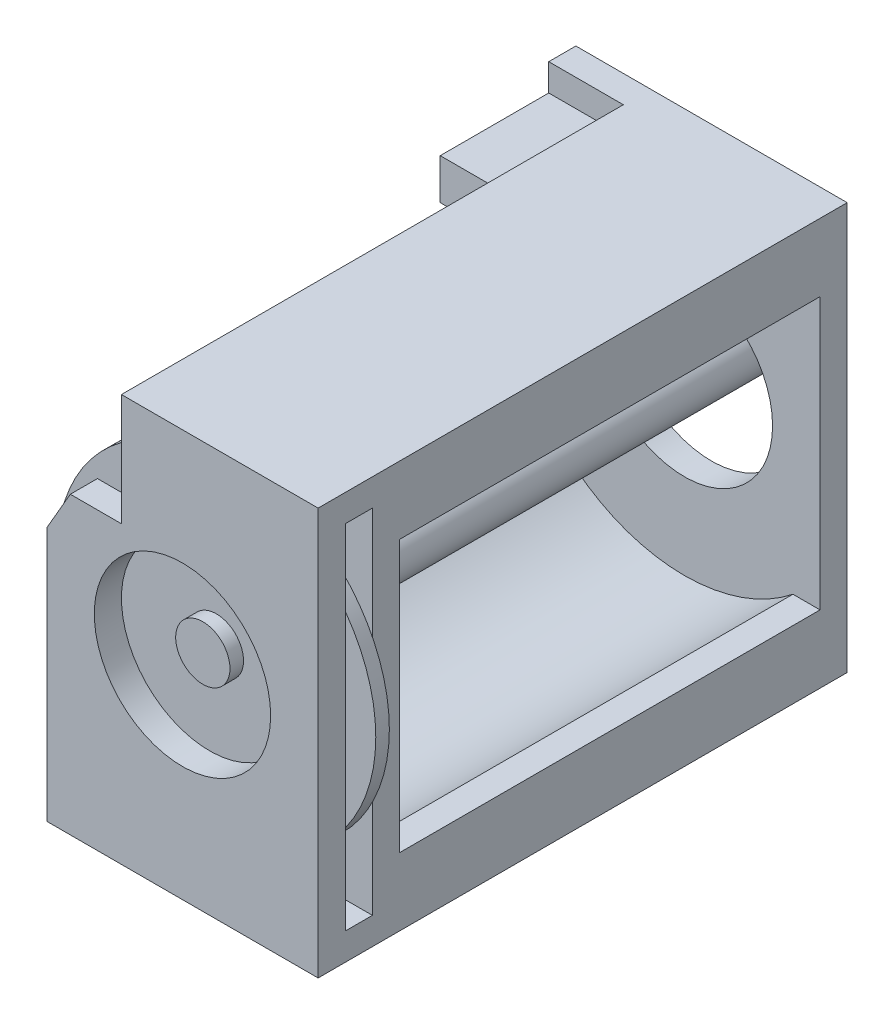
ISO-10303-21;
HEADER;
FILE_DESCRIPTION(('STEP AP214'),'2;1');
FILE_NAME('part.step','',(''),(''),'','','');
FILE_SCHEMA(('AUTOMOTIVE_DESIGN { 1 0 10303 214 1 1 1 1 }'));
ENDSEC;
DATA;
#1=APPLICATION_CONTEXT('core data for automotive mechanical design processes');
#2=APPLICATION_PROTOCOL_DEFINITION('international standard','automotive_design',2000,#1);
#3=PRODUCT_CONTEXT('',#1,'mechanical');
#4=PRODUCT('Part','Part','',(#3));
#5=PRODUCT_RELATED_PRODUCT_CATEGORY('part','',(#4));
#6=PRODUCT_DEFINITION_FORMATION('','',#4);
#7=PRODUCT_DEFINITION_CONTEXT('part definition',#1,'design');
#8=PRODUCT_DEFINITION('design','',#6,#7);
#9=PRODUCT_DEFINITION_SHAPE('','',#8);
#10=(LENGTH_UNIT() NAMED_UNIT(*) SI_UNIT(.MILLI.,.METRE.));
#11=(NAMED_UNIT(*) PLANE_ANGLE_UNIT() SI_UNIT($,.RADIAN.));
#12=(NAMED_UNIT(*) SI_UNIT($,.STERADIAN.) SOLID_ANGLE_UNIT());
#13=UNCERTAINTY_MEASURE_WITH_UNIT(LENGTH_MEASURE(1.E-05),#10,'distance_accuracy_value','');
#14=(GEOMETRIC_REPRESENTATION_CONTEXT(3) GLOBAL_UNCERTAINTY_ASSIGNED_CONTEXT((#13)) GLOBAL_UNIT_ASSIGNED_CONTEXT((#10,
#11,#12)) REPRESENTATION_CONTEXT('',''));
#15=CARTESIAN_POINT('',(0.,0.,0.));
#16=DIRECTION('',(0.,0.,1.));
#17=DIRECTION('',(1.,0.,0.));
#18=AXIS2_PLACEMENT_3D('',#15,#16,#17);
#19=CARTESIAN_POINT('',(0.,0.,-5.));
#20=DIRECTION('',(0.,0.,1.));
#21=DIRECTION('',(1.,0.,0.));
#22=AXIS2_PLACEMENT_3D('',#19,#20,#21);
#23=CYLINDRICAL_SURFACE('',#22,2.);
#24=CARTESIAN_POINT('',(0.,0.,-5.));
#25=DIRECTION('',(0.,0.,1.));
#26=DIRECTION('',(1.,0.,0.));
#27=AXIS2_PLACEMENT_3D('',#24,#25,#26);
#28=CIRCLE('',#27,2.);
#29=CARTESIAN_POINT('',(2.,0.,-5.));
#30=VERTEX_POINT('',#29);
#31=EDGE_CURVE('E11',#30,#30,#28,.T.);
#32=ORIENTED_EDGE('',*,*,#31,.T.);
#33=EDGE_LOOP('',(#32));
#34=FACE_BOUND('',#33,.T.);
#35=CARTESIAN_POINT('',(0.,0.,37.5));
#36=DIRECTION('',(0.,0.,1.));
#37=DIRECTION('',(1.,0.,0.));
#38=AXIS2_PLACEMENT_3D('',#35,#36,#37);
#39=CIRCLE('',#38,2.);
#40=CARTESIAN_POINT('',(2.,0.,37.5));
#41=VERTEX_POINT('',#40);
#42=EDGE_CURVE('E49',#41,#41,#39,.T.);
#43=ORIENTED_EDGE('',*,*,#42,.F.);
#44=EDGE_LOOP('',(#43));
#45=FACE_BOUND('',#44,.T.);
#46=ADVANCED_FACE('F43',(#34,#45),#23,.T.);
#47=CARTESIAN_POINT('',(0.,0.,-5.));
#48=DIRECTION('',(0.,0.,1.));
#49=DIRECTION('',(1.,0.,0.));
#50=AXIS2_PLACEMENT_3D('',#47,#48,#49);
#51=PLANE('',#50);
#52=ORIENTED_EDGE('',*,*,#31,.F.);
#53=EDGE_LOOP('',(#52));
#54=FACE_BOUND('',#53,.T.);
#55=ADVANCED_FACE('F58',(#54),#51,.F.);
#56=CARTESIAN_POINT('',(0.,0.,37.5));
#57=DIRECTION('',(0.,0.,1.));
#58=DIRECTION('',(1.,0.,0.));
#59=AXIS2_PLACEMENT_3D('',#56,#57,#58);
#60=PLANE('',#59);
#61=ORIENTED_EDGE('',*,*,#42,.T.);
#62=EDGE_LOOP('',(#61));
#63=FACE_BOUND('',#62,.T.);
#64=ADVANCED_FACE('F55',(#63),#60,.T.);
#65=CLOSED_SHELL('',(#46,#55,#64));
#66=MANIFOLD_SOLID_BREP('B2',#65);
#67=CARTESIAN_POINT('',(0.,0.,36.5));
#68=DIRECTION('',(0.,0.,1.));
#69=DIRECTION('',(1.,0.,0.));
#70=AXIS2_PLACEMENT_3D('',#67,#68,#69);
#71=PLANE('',#70);
#72=CARTESIAN_POINT('',(0.,0.,36.5));
#73=DIRECTION('',(0.,0.,1.));
#74=DIRECTION('',(1.,0.,0.));
#75=AXIS2_PLACEMENT_3D('',#72,#73,#74);
#76=CIRCLE('',#75,11.75);
#77=CARTESIAN_POINT('',(11.75,0.,36.5));
#78=VERTEX_POINT('',#77);
#79=EDGE_CURVE('E42',#78,#78,#76,.T.);
#80=ORIENTED_EDGE('',*,*,#79,.T.);
#81=EDGE_LOOP('',(#80));
#82=FACE_BOUND('',#81,.T.);
#83=CARTESIAN_POINT('',(0.,0.,36.5));
#84=DIRECTION('',(0.,0.,1.));
#85=DIRECTION('',(1.,0.,0.));
#86=AXIS2_PLACEMENT_3D('',#83,#84,#85);
#87=CIRCLE('',#86,2.);
#88=CARTESIAN_POINT('',(2.,0.,36.5));
#89=VERTEX_POINT('',#88);
#90=EDGE_CURVE('E103',#89,#89,#87,.T.);
#91=ORIENTED_EDGE('',*,*,#90,.F.);
#92=EDGE_LOOP('',(#91));
#93=FACE_BOUND('',#92,.T.);
#94=ADVANCED_FACE('F92',(#82,#93),#71,.T.);
#95=CARTESIAN_POINT('',(0.,0.,35.5));
#96=DIRECTION('',(0.,0.,1.));
#97=DIRECTION('',(1.,0.,0.));
#98=AXIS2_PLACEMENT_3D('',#95,#96,#97);
#99=PLANE('',#98);
#100=CARTESIAN_POINT('',(0.,0.,35.5));
#101=DIRECTION('',(0.,0.,1.));
#102=DIRECTION('',(1.,0.,0.));
#103=AXIS2_PLACEMENT_3D('',#100,#101,#102);
#104=CIRCLE('',#103,11.75);
#105=CARTESIAN_POINT('',(11.75,0.,35.5));
#106=VERTEX_POINT('',#105);
#107=EDGE_CURVE('E96',#106,#106,#104,.T.);
#108=ORIENTED_EDGE('',*,*,#107,.F.);
#109=EDGE_LOOP('',(#108));
#110=FACE_BOUND('',#109,.T.);
#111=CARTESIAN_POINT('',(0.,0.,35.5));
#112=DIRECTION('',(0.,0.,1.));
#113=DIRECTION('',(1.,0.,0.));
#114=AXIS2_PLACEMENT_3D('',#111,#112,#113);
#115=CIRCLE('',#114,2.);
#116=CARTESIAN_POINT('',(2.,0.,35.5));
#117=VERTEX_POINT('',#116);
#118=EDGE_CURVE('E105',#117,#117,#115,.T.);
#119=ORIENTED_EDGE('',*,*,#118,.T.);
#120=EDGE_LOOP('',(#119));
#121=FACE_BOUND('',#120,.T.);
#122=ADVANCED_FACE('F115',(#110,#121),#99,.F.);
#123=CARTESIAN_POINT('',(0.,0.,36.5));
#124=DIRECTION('',(0.,0.,-1.));
#125=DIRECTION('',(-1.,0.,0.));
#126=AXIS2_PLACEMENT_3D('',#123,#124,#125);
#127=CYLINDRICAL_SURFACE('',#126,11.75);
#128=ORIENTED_EDGE('',*,*,#79,.F.);
#129=EDGE_LOOP('',(#128));
#130=FACE_BOUND('',#129,.T.);
#131=ORIENTED_EDGE('',*,*,#107,.T.);
#132=EDGE_LOOP('',(#131));
#133=FACE_BOUND('',#132,.T.);
#134=ADVANCED_FACE('F94',(#130,#133),#127,.T.);
#135=CARTESIAN_POINT('',(0.,0.,36.5));
#136=DIRECTION('',(0.,0.,-1.));
#137=DIRECTION('',(-1.,0.,0.));
#138=AXIS2_PLACEMENT_3D('',#135,#136,#137);
#139=CYLINDRICAL_SURFACE('',#138,2.);
#140=ORIENTED_EDGE('',*,*,#90,.T.);
#141=EDGE_LOOP('',(#140));
#142=FACE_BOUND('',#141,.T.);
#143=ORIENTED_EDGE('',*,*,#118,.F.);
#144=EDGE_LOOP('',(#143));
#145=FACE_BOUND('',#144,.T.);
#146=ADVANCED_FACE('F111',(#142,#145),#139,.F.);
#147=CLOSED_SHELL('',(#94,#122,#134,#146));
#148=MANIFOLD_SOLID_BREP('B6',#147);
#149=CARTESIAN_POINT('',(0.,0.,2.));
#150=DIRECTION('',(0.,0.,1.));
#151=DIRECTION('',(1.,0.,0.));
#152=AXIS2_PLACEMENT_3D('',#149,#150,#151);
#153=PLANE('',#152);
#154=CARTESIAN_POINT('',(0.,0.,2.));
#155=DIRECTION('',(0.,0.,1.));
#156=DIRECTION('',(1.,0.,0.));
#157=AXIS2_PLACEMENT_3D('',#154,#155,#156);
#158=CIRCLE('',#157,6.5);
#159=CARTESIAN_POINT('',(6.5,0.,2.));
#160=VERTEX_POINT('',#159);
#161=EDGE_CURVE('E482',#160,#160,#158,.T.);
#162=ORIENTED_EDGE('',*,*,#161,.F.);
#163=EDGE_LOOP('',(#162));
#164=FACE_BOUND('',#163,.T.);
#165=CARTESIAN_POINT('',(0.,0.,2.));
#166=DIRECTION('',(0.,0.,1.));
#167=DIRECTION('',(1.,0.,0.));
#168=AXIS2_PLACEMENT_3D('',#165,#166,#167);
#169=CIRCLE('',#168,12.8062484748657);
#170=CARTESIAN_POINT('',(8.,10.,2.));
#171=VERTEX_POINT('',#170);
#172=CARTESIAN_POINT('',(-8.,10.,2.));
#173=VERTEX_POINT('',#172);
#174=EDGE_CURVE('E468',#171,#173,#169,.T.);
#175=ORIENTED_EDGE('',*,*,#174,.T.);
#176=DIRECTION('',(-1.,0.,0.));
#177=VECTOR('',#176,1.);
#178=CARTESIAN_POINT('',(0.,10.,2.));
#179=LINE('',#178,#177);
#180=CARTESIAN_POINT('',(-10.,10.,2.));
#181=VERTEX_POINT('',#180);
#182=EDGE_CURVE('E348',#173,#181,#179,.T.);
#183=ORIENTED_EDGE('',*,*,#182,.T.);
#184=DIRECTION('',(0.,-1.,0.));
#185=VECTOR('',#184,1.);
#186=CARTESIAN_POINT('',(-10.,0.,2.));
#187=LINE('',#186,#185);
#188=CARTESIAN_POINT('',(-10.,-10.,2.));
#189=VERTEX_POINT('',#188);
#190=EDGE_CURVE('E477',#181,#189,#187,.T.);
#191=ORIENTED_EDGE('',*,*,#190,.T.);
#192=DIRECTION('',(-1.,0.,0.));
#193=VECTOR('',#192,1.);
#194=CARTESIAN_POINT('',(0.,-10.,2.));
#195=LINE('',#194,#193);
#196=CARTESIAN_POINT('',(-8.,-10.,2.));
#197=VERTEX_POINT('',#196);
#198=EDGE_CURVE('E455',#197,#189,#195,.T.);
#199=ORIENTED_EDGE('',*,*,#198,.F.);
#200=CARTESIAN_POINT('',(0.,0.,2.));
#201=DIRECTION('',(0.,0.,1.));
#202=DIRECTION('',(1.,0.,0.));
#203=AXIS2_PLACEMENT_3D('',#200,#201,#202);
#204=CIRCLE('',#203,12.8062484748657);
#205=CARTESIAN_POINT('',(8.,-10.,2.));
#206=VERTEX_POINT('',#205);
#207=EDGE_CURVE('E458',#197,#206,#204,.T.);
#208=ORIENTED_EDGE('',*,*,#207,.T.);
#209=DIRECTION('',(-1.,0.,0.));
#210=VECTOR('',#209,1.);
#211=CARTESIAN_POINT('',(0.,-10.,2.));
#212=LINE('',#211,#210);
#213=CARTESIAN_POINT('',(10.,-10.,2.));
#214=VERTEX_POINT('',#213);
#215=EDGE_CURVE('E461',#214,#206,#212,.T.);
#216=ORIENTED_EDGE('',*,*,#215,.F.);
#217=DIRECTION('',(0.,-1.,0.));
#218=VECTOR('',#217,1.);
#219=CARTESIAN_POINT('',(10.,0.,2.));
#220=LINE('',#219,#218);
#221=CARTESIAN_POINT('',(10.,10.,2.));
#222=VERTEX_POINT('',#221);
#223=EDGE_CURVE('E474',#222,#214,#220,.T.);
#224=ORIENTED_EDGE('',*,*,#223,.F.);
#225=DIRECTION('',(-1.,0.,0.));
#226=VECTOR('',#225,1.);
#227=CARTESIAN_POINT('',(0.,10.,2.));
#228=LINE('',#227,#226);
#229=EDGE_CURVE('E470',#222,#171,#228,.T.);
#230=ORIENTED_EDGE('',*,*,#229,.T.);
#231=EDGE_LOOP('',(#175,#183,#191,#199,#208,#216,#224,#230));
#232=FACE_BOUND('',#231,.T.);
#233=ADVANCED_FACE('F153',(#164,#232),#153,.T.);
#234=CARTESIAN_POINT('',(-10.,15.,2.));
#235=VERTEX_POINT('',#234);
#236=CARTESIAN_POINT('',(-10.,13.,2.));
#237=VERTEX_POINT('',#236);
#238=EDGE_CURVE('E479',#235,#237,#187,.T.);
#239=ORIENTED_EDGE('',*,*,#238,.T.);
#240=DIRECTION('',(1.,0.,0.));
#241=VECTOR('',#240,1.);
#242=CARTESIAN_POINT('',(0.,13.,2.));
#243=LINE('',#242,#241);
#244=CARTESIAN_POINT('',(-4.5,13.,2.));
#245=VERTEX_POINT('',#244);
#246=EDGE_CURVE('E349',#237,#245,#243,.T.);
#247=ORIENTED_EDGE('',*,*,#246,.T.);
#248=DIRECTION('',(0.,1.,0.));
#249=VECTOR('',#248,1.);
#250=CARTESIAN_POINT('',(-4.5,15.,2.));
#251=LINE('',#250,#249);
#252=CARTESIAN_POINT('',(-4.5,15.,2.));
#253=VERTEX_POINT('',#252);
#254=EDGE_CURVE('E361',#245,#253,#251,.T.);
#255=ORIENTED_EDGE('',*,*,#254,.T.);
#256=DIRECTION('',(-1.,0.,0.));
#257=VECTOR('',#256,1.);
#258=CARTESIAN_POINT('',(-10.,15.,2.));
#259=LINE('',#258,#257);
#260=EDGE_CURVE('E363',#253,#235,#259,.T.);
#261=ORIENTED_EDGE('',*,*,#260,.T.);
#262=EDGE_LOOP('',(#239,#247,#255,#261));
#263=FACE_BOUND('',#262,.T.);
#264=ADVANCED_FACE('F613',(#263),#153,.T.);
#265=CARTESIAN_POINT('',(-4.5,15.,2.));
#266=DIRECTION('',(1.,0.,0.));
#267=DIRECTION('',(0.,1.,0.));
#268=AXIS2_PLACEMENT_3D('',#265,#266,#267);
#269=PLANE('',#268);
#270=DIRECTION('',(0.,0.,-1.));
#271=VECTOR('',#270,1.);
#272=CARTESIAN_POINT('',(-4.5,13.,2.));
#273=LINE('',#272,#271);
#274=CARTESIAN_POINT('',(-4.5,13.,10.));
#275=VERTEX_POINT('',#274);
#276=EDGE_CURVE('E523',#275,#245,#273,.T.);
#277=ORIENTED_EDGE('',*,*,#276,.F.);
#278=DIRECTION('',(0.,-1.,0.));
#279=VECTOR('',#278,1.);
#280=CARTESIAN_POINT('',(-4.5,15.,10.));
#281=LINE('',#280,#279);
#282=CARTESIAN_POINT('',(-4.5,11.9895788082818,10.));
#283=VERTEX_POINT('',#282);
#284=EDGE_CURVE('E521',#275,#283,#281,.T.);
#285=ORIENTED_EDGE('',*,*,#284,.T.);
#286=DIRECTION('',(0.,0.,-1.));
#287=VECTOR('',#286,1.);
#288=CARTESIAN_POINT('',(-4.5,11.9895788082818,34.));
#289=LINE('',#288,#287);
#290=CARTESIAN_POINT('',(-4.5,11.9895788082818,33.));
#291=VERTEX_POINT('',#290);
#292=EDGE_CURVE('E332',#291,#283,#289,.T.);
#293=ORIENTED_EDGE('',*,*,#292,.F.);
#294=DIRECTION('',(0.,1.,0.));
#295=VECTOR('',#294,1.);
#296=CARTESIAN_POINT('',(-4.5,0.,33.));
#297=LINE('',#296,#295);
#298=CARTESIAN_POINT('',(-4.5,6.75,33.));
#299=VERTEX_POINT('',#298);
#300=EDGE_CURVE('E385',#299,#291,#297,.T.);
#301=ORIENTED_EDGE('',*,*,#300,.F.);
#302=DIRECTION('',(0.,0.,1.));
#303=VECTOR('',#302,1.);
#304=CARTESIAN_POINT('',(-4.5,6.75,2.));
#305=LINE('',#304,#303);
#306=CARTESIAN_POINT('',(-4.5,6.75,35.));
#307=VERTEX_POINT('',#306);
#308=EDGE_CURVE('E374',#299,#307,#305,.T.);
#309=ORIENTED_EDGE('',*,*,#308,.T.);
#310=DIRECTION('',(0.,1.,0.));
#311=VECTOR('',#310,1.);
#312=CARTESIAN_POINT('',(-4.5,0.,35.));
#313=LINE('',#312,#311);
#314=CARTESIAN_POINT('',(-4.5,13.,35.));
#315=VERTEX_POINT('',#314);
#316=EDGE_CURVE('E383',#307,#315,#313,.T.);
#317=ORIENTED_EDGE('',*,*,#316,.T.);
#318=DIRECTION('',(0.,0.,-1.));
#319=VECTOR('',#318,1.);
#320=CARTESIAN_POINT('',(-4.5,13.,39.));
#321=LINE('',#320,#319);
#322=CARTESIAN_POINT('',(-4.5,13.,37.));
#323=VERTEX_POINT('',#322);
#324=EDGE_CURVE('E380',#323,#315,#321,.T.);
#325=ORIENTED_EDGE('',*,*,#324,.F.);
#326=DIRECTION('',(0.,1.,0.));
#327=VECTOR('',#326,1.);
#328=CARTESIAN_POINT('',(-4.5,0.,37.));
#329=LINE('',#328,#327);
#330=CARTESIAN_POINT('',(-4.5,6.75,37.));
#331=VERTEX_POINT('',#330);
#332=EDGE_CURVE('E518',#331,#323,#329,.T.);
#333=ORIENTED_EDGE('',*,*,#332,.F.);
#334=CARTESIAN_POINT('',(-4.5,6.75,39.));
#335=VERTEX_POINT('',#334);
#336=EDGE_CURVE('E367',#331,#335,#305,.T.);
#337=ORIENTED_EDGE('',*,*,#336,.T.);
#338=DIRECTION('',(0.,1.,0.));
#339=VECTOR('',#338,1.);
#340=CARTESIAN_POINT('',(-4.5,15.,39.));
#341=LINE('',#340,#339);
#342=CARTESIAN_POINT('',(-4.5,15.,39.));
#343=VERTEX_POINT('',#342);
#344=EDGE_CURVE('E364',#335,#343,#341,.T.);
#345=ORIENTED_EDGE('',*,*,#344,.T.);
#346=DIRECTION('',(0.,0.,1.));
#347=VECTOR('',#346,1.);
#348=CARTESIAN_POINT('',(-4.5,15.,2.));
#349=LINE('',#348,#347);
#350=EDGE_CURVE('E370',#253,#343,#349,.T.);
#351=ORIENTED_EDGE('',*,*,#350,.F.);
#352=ORIENTED_EDGE('',*,*,#254,.F.);
#353=EDGE_LOOP('',(#277,#285,#293,#301,#309,#317,#325,#333,#337,#345,#351,#352));
#354=FACE_BOUND('',#353,.T.);
#355=ADVANCED_FACE('F589',(#354),#269,.F.);
#356=CARTESIAN_POINT('',(0.,13.,39.));
#357=DIRECTION('',(0.,1.,0.));
#358=DIRECTION('',(0.,0.,1.));
#359=AXIS2_PLACEMENT_3D('',#356,#357,#358);
#360=PLANE('',#359);
#361=DIRECTION('',(1.,0.,0.));
#362=VECTOR('',#361,1.);
#363=CARTESIAN_POINT('',(0.,13.,37.));
#364=LINE('',#363,#362);
#365=CARTESIAN_POINT('',(10.,13.,37.));
#366=VERTEX_POINT('',#365);
#367=EDGE_CURVE('E511',#323,#366,#364,.T.);
#368=ORIENTED_EDGE('',*,*,#367,.F.);
#369=ORIENTED_EDGE('',*,*,#324,.T.);
#370=DIRECTION('',(-1.,0.,0.));
#371=VECTOR('',#370,1.);
#372=CARTESIAN_POINT('',(0.,13.,35.));
#373=LINE('',#372,#371);
#374=CARTESIAN_POINT('',(10.,13.,35.));
#375=VERTEX_POINT('',#374);
#376=EDGE_CURVE('E508',#375,#315,#373,.T.);
#377=ORIENTED_EDGE('',*,*,#376,.F.);
#378=DIRECTION('',(0.,0.,-1.));
#379=VECTOR('',#378,1.);
#380=CARTESIAN_POINT('',(10.,13.,39.));
#381=LINE('',#380,#379);
#382=EDGE_CURVE('E418',#366,#375,#381,.T.);
#383=ORIENTED_EDGE('',*,*,#382,.F.);
#384=EDGE_LOOP('',(#368,#369,#377,#383));
#385=FACE_BOUND('',#384,.T.);
#386=ADVANCED_FACE('F557',(#385),#360,.F.);
#387=CARTESIAN_POINT('',(0.,0.,35.));
#388=DIRECTION('',(0.,0.,1.));
#389=DIRECTION('',(1.,0.,0.));
#390=AXIS2_PLACEMENT_3D('',#387,#388,#389);
#391=PLANE('',#390);
#392=DIRECTION('',(1.,0.,0.));
#393=VECTOR('',#392,1.);
#394=CARTESIAN_POINT('',(0.,6.75,35.));
#395=LINE('',#394,#393);
#396=CARTESIAN_POINT('',(-8.26794919243112,6.75,35.));
#397=VERTEX_POINT('',#396);
#398=EDGE_CURVE('E378',#397,#307,#395,.T.);
#399=ORIENTED_EDGE('',*,*,#398,.F.);
#400=DIRECTION('',(0.499999999999999,0.86602540378444,0.));
#401=VECTOR('',#400,1.);
#402=CARTESIAN_POINT('',(-9.12379763209583,5.26762701892218,35.));
#403=LINE('',#402,#401);
#404=CARTESIAN_POINT('',(-10.,3.74999999999998,35.));
#405=VERTEX_POINT('',#404);
#406=EDGE_CURVE('E528',#397,#405,#403,.F.);
#407=ORIENTED_EDGE('',*,*,#406,.T.);
#408=DIRECTION('',(0.,-1.,0.));
#409=VECTOR('',#408,1.);
#410=CARTESIAN_POINT('',(-10.,0.,35.));
#411=LINE('',#410,#409);
#412=CARTESIAN_POINT('',(-10.,-13.,35.));
#413=VERTEX_POINT('',#412);
#414=EDGE_CURVE('E424',#405,#413,#411,.T.);
#415=ORIENTED_EDGE('',*,*,#414,.T.);
#416=DIRECTION('',(-1.,0.,0.));
#417=VECTOR('',#416,1.);
#418=CARTESIAN_POINT('',(0.,-13.,35.));
#419=LINE('',#418,#417);
#420=CARTESIAN_POINT('',(10.,-13.,35.));
#421=VERTEX_POINT('',#420);
#422=EDGE_CURVE('E394',#421,#413,#419,.T.);
#423=ORIENTED_EDGE('',*,*,#422,.F.);
#424=DIRECTION('',(0.,-1.,0.));
#425=VECTOR('',#424,1.);
#426=CARTESIAN_POINT('',(10.,0.,35.));
#427=LINE('',#426,#425);
#428=EDGE_CURVE('E421',#375,#421,#427,.T.);
#429=ORIENTED_EDGE('',*,*,#428,.F.);
#430=ORIENTED_EDGE('',*,*,#376,.T.);
#431=ORIENTED_EDGE('',*,*,#316,.F.);
#432=EDGE_LOOP('',(#399,#407,#415,#423,#429,#430,#431));
#433=FACE_BOUND('',#432,.T.);
#434=CARTESIAN_POINT('',(0.,0.,35.));
#435=DIRECTION('',(0.,0.,1.));
#436=DIRECTION('',(1.,0.,0.));
#437=AXIS2_PLACEMENT_3D('',#434,#435,#436);
#438=CIRCLE('',#437,6.5);
#439=CARTESIAN_POINT('',(6.5,0.,35.));
#440=VERTEX_POINT('',#439);
#441=EDGE_CURVE('E427',#440,#440,#438,.T.);
#442=ORIENTED_EDGE('',*,*,#441,.F.);
#443=EDGE_LOOP('',(#442));
#444=FACE_BOUND('',#443,.T.);
#445=ADVANCED_FACE('F590',(#433,#444),#391,.T.);
#446=CARTESIAN_POINT('',(0.,10.,34.));
#447=DIRECTION('',(0.,1.,0.));
#448=DIRECTION('',(0.,0.,1.));
#449=AXIS2_PLACEMENT_3D('',#446,#447,#448);
#450=PLANE('',#449);
#451=DIRECTION('',(1.,0.,0.));
#452=VECTOR('',#451,1.);
#453=CARTESIAN_POINT('',(0.,10.,33.));
#454=LINE('',#453,#452);
#455=CARTESIAN_POINT('',(8.,10.,33.));
#456=VERTEX_POINT('',#455);
#457=CARTESIAN_POINT('',(10.,10.,33.));
#458=VERTEX_POINT('',#457);
#459=EDGE_CURVE('E443',#456,#458,#454,.T.);
#460=ORIENTED_EDGE('',*,*,#459,.F.);
#461=DIRECTION('',(0.,0.,-1.));
#462=VECTOR('',#461,1.);
#463=CARTESIAN_POINT('',(8.,10.,34.));
#464=LINE('',#463,#462);
#465=EDGE_CURVE('E464',#456,#171,#464,.T.);
#466=ORIENTED_EDGE('',*,*,#465,.T.);
#467=ORIENTED_EDGE('',*,*,#229,.F.);
#468=DIRECTION('',(0.,0.,-1.));
#469=VECTOR('',#468,1.);
#470=CARTESIAN_POINT('',(10.,10.,34.));
#471=LINE('',#470,#469);
#472=EDGE_CURVE('E466',#458,#222,#471,.T.);
#473=ORIENTED_EDGE('',*,*,#472,.F.);
#474=EDGE_LOOP('',(#460,#466,#467,#473));
#475=FACE_BOUND('',#474,.T.);
#476=ADVANCED_FACE('F593',(#475),#450,.F.);
#477=CARTESIAN_POINT('',(0.,0.,34.));
#478=DIRECTION('',(0.,0.,-1.));
#479=DIRECTION('',(-1.,0.,0.));
#480=AXIS2_PLACEMENT_3D('',#477,#478,#479);
#481=CYLINDRICAL_SURFACE('',#480,12.8062484748657);
#482=ORIENTED_EDGE('',*,*,#292,.T.);
#483=CARTESIAN_POINT('',(0.,0.,10.));
#484=DIRECTION('',(0.,0.,1.));
#485=DIRECTION('',(1.,0.,0.));
#486=AXIS2_PLACEMENT_3D('',#483,#484,#485);
#487=CIRCLE('',#486,12.8062484748657);
#488=CARTESIAN_POINT('',(-8.,10.,10.));
#489=VERTEX_POINT('',#488);
#490=EDGE_CURVE('E325',#489,#283,#487,.F.);
#491=ORIENTED_EDGE('',*,*,#490,.F.);
#492=DIRECTION('',(0.,0.,-1.));
#493=VECTOR('',#492,1.);
#494=CARTESIAN_POINT('',(-8.,10.,10.));
#495=LINE('',#494,#493);
#496=EDGE_CURVE('E330',#489,#173,#495,.T.);
#497=ORIENTED_EDGE('',*,*,#496,.T.);
#498=ORIENTED_EDGE('',*,*,#174,.F.);
#499=ORIENTED_EDGE('',*,*,#465,.F.);
#500=CARTESIAN_POINT('',(0.,0.,33.));
#501=DIRECTION('',(0.,0.,1.));
#502=DIRECTION('',(1.,0.,0.));
#503=AXIS2_PLACEMENT_3D('',#500,#501,#502);
#504=CIRCLE('',#503,12.8062484748657);
#505=EDGE_CURVE('E441',#291,#456,#504,.F.);
#506=ORIENTED_EDGE('',*,*,#505,.F.);
#507=EDGE_LOOP('',(#482,#491,#497,#498,#499,#506));
#508=FACE_BOUND('',#507,.T.);
#509=ADVANCED_FACE('F327',(#508),#481,.F.);
#510=CARTESIAN_POINT('',(0.,-10.,34.));
#511=DIRECTION('',(0.,1.,0.));
#512=DIRECTION('',(0.,0.,1.));
#513=AXIS2_PLACEMENT_3D('',#510,#511,#512);
#514=PLANE('',#513);
#515=DIRECTION('',(0.,0.,-1.));
#516=VECTOR('',#515,1.);
#517=CARTESIAN_POINT('',(8.,-10.,34.));
#518=LINE('',#517,#516);
#519=CARTESIAN_POINT('',(8.,-10.,33.));
#520=VERTEX_POINT('',#519);
#521=EDGE_CURVE('E451',#520,#206,#518,.T.);
#522=ORIENTED_EDGE('',*,*,#521,.F.);
#523=DIRECTION('',(1.,0.,0.));
#524=VECTOR('',#523,1.);
#525=CARTESIAN_POINT('',(0.,-10.,33.));
#526=LINE('',#525,#524);
#527=CARTESIAN_POINT('',(10.,-10.,33.));
#528=VERTEX_POINT('',#527);
#529=EDGE_CURVE('E439',#520,#528,#526,.T.);
#530=ORIENTED_EDGE('',*,*,#529,.T.);
#531=DIRECTION('',(0.,0.,-1.));
#532=VECTOR('',#531,1.);
#533=CARTESIAN_POINT('',(10.,-10.,34.));
#534=LINE('',#533,#532);
#535=EDGE_CURVE('E453',#528,#214,#534,.T.);
#536=ORIENTED_EDGE('',*,*,#535,.T.);
#537=ORIENTED_EDGE('',*,*,#215,.T.);
#538=EDGE_LOOP('',(#522,#530,#536,#537));
#539=FACE_BOUND('',#538,.T.);
#540=ADVANCED_FACE('F693',(#539),#514,.T.);
#541=CARTESIAN_POINT('',(0.,0.,34.));
#542=DIRECTION('',(0.,0.,-1.));
#543=DIRECTION('',(-1.,0.,0.));
#544=AXIS2_PLACEMENT_3D('',#541,#542,#543);
#545=CYLINDRICAL_SURFACE('',#544,12.8062484748657);
#546=CARTESIAN_POINT('',(0.,0.,33.));
#547=DIRECTION('',(0.,0.,1.));
#548=DIRECTION('',(1.,0.,0.));
#549=AXIS2_PLACEMENT_3D('',#546,#547,#548);
#550=CIRCLE('',#549,12.8062484748657);
#551=CARTESIAN_POINT('',(-8.,-10.,33.));
#552=VERTEX_POINT('',#551);
#553=EDGE_CURVE('E430',#520,#552,#550,.F.);
#554=ORIENTED_EDGE('',*,*,#553,.F.);
#555=ORIENTED_EDGE('',*,*,#521,.T.);
#556=ORIENTED_EDGE('',*,*,#207,.F.);
#557=DIRECTION('',(0.,0.,-1.));
#558=VECTOR('',#557,1.);
#559=CARTESIAN_POINT('',(-8.,-10.,34.));
#560=LINE('',#559,#558);
#561=EDGE_CURVE('E449',#552,#197,#560,.T.);
#562=ORIENTED_EDGE('',*,*,#561,.F.);
#563=EDGE_LOOP('',(#554,#555,#556,#562));
#564=FACE_BOUND('',#563,.T.);
#565=ADVANCED_FACE('F700',(#564),#545,.F.);
#566=CARTESIAN_POINT('',(0.,-10.,34.));
#567=DIRECTION('',(0.,1.,0.));
#568=DIRECTION('',(0.,0.,1.));
#569=AXIS2_PLACEMENT_3D('',#566,#567,#568);
#570=PLANE('',#569);
#571=DIRECTION('',(0.,0.,-1.));
#572=VECTOR('',#571,1.);
#573=CARTESIAN_POINT('',(-10.,-10.,34.));
#574=LINE('',#573,#572);
#575=CARTESIAN_POINT('',(-10.,-10.,33.));
#576=VERTEX_POINT('',#575);
#577=EDGE_CURVE('E446',#576,#189,#574,.T.);
#578=ORIENTED_EDGE('',*,*,#577,.F.);
#579=DIRECTION('',(1.,0.,0.));
#580=VECTOR('',#579,1.);
#581=CARTESIAN_POINT('',(0.,-10.,33.));
#582=LINE('',#581,#580);
#583=EDGE_CURVE('E506',#576,#552,#582,.T.);
#584=ORIENTED_EDGE('',*,*,#583,.T.);
#585=ORIENTED_EDGE('',*,*,#561,.T.);
#586=ORIENTED_EDGE('',*,*,#198,.T.);
#587=EDGE_LOOP('',(#578,#584,#585,#586));
#588=FACE_BOUND('',#587,.T.);
#589=ADVANCED_FACE('F639',(#588),#570,.T.);
#590=CARTESIAN_POINT('',(10.,0.,2.));
#591=DIRECTION('',(1.,0.,0.));
#592=DIRECTION('',(0.,1.,0.));
#593=AXIS2_PLACEMENT_3D('',#590,#591,#592);
#594=PLANE('',#593);
#595=ORIENTED_EDGE('',*,*,#428,.T.);
#596=DIRECTION('',(0.,0.,-1.));
#597=VECTOR('',#596,1.);
#598=CARTESIAN_POINT('',(10.,-13.,39.));
#599=LINE('',#598,#597);
#600=CARTESIAN_POINT('',(10.,-13.,37.));
#601=VERTEX_POINT('',#600);
#602=EDGE_CURVE('E389',#601,#421,#599,.T.);
#603=ORIENTED_EDGE('',*,*,#602,.F.);
#604=DIRECTION('',(0.,-1.,0.));
#605=VECTOR('',#604,1.);
#606=CARTESIAN_POINT('',(10.,0.,37.));
#607=LINE('',#606,#605);
#608=EDGE_CURVE('E397',#366,#601,#607,.T.);
#609=ORIENTED_EDGE('',*,*,#608,.F.);
#610=ORIENTED_EDGE('',*,*,#382,.T.);
#611=EDGE_LOOP('',(#595,#603,#609,#610));
#612=FACE_BOUND('',#611,.T.);
#613=DIRECTION('',(0.,-1.,0.));
#614=VECTOR('',#613,1.);
#615=CARTESIAN_POINT('',(10.,0.,39.));
#616=LINE('',#615,#614);
#617=CARTESIAN_POINT('',(10.,15.,39.));
#618=VERTEX_POINT('',#617);
#619=CARTESIAN_POINT('',(10.,-15.,39.));
#620=VERTEX_POINT('',#619);
#621=EDGE_CURVE('E405',#618,#620,#616,.T.);
#622=ORIENTED_EDGE('',*,*,#621,.T.);
#623=DIRECTION('',(0.,0.,-1.));
#624=VECTOR('',#623,1.);
#625=CARTESIAN_POINT('',(10.,-15.,2.));
#626=LINE('',#625,#624);
#627=CARTESIAN_POINT('',(10.,-15.,0.));
#628=VERTEX_POINT('',#627);
#629=EDGE_CURVE('E485',#620,#628,#626,.T.);
#630=ORIENTED_EDGE('',*,*,#629,.T.);
#631=DIRECTION('',(0.,-1.,0.));
#632=VECTOR('',#631,1.);
#633=CARTESIAN_POINT('',(10.,0.,0.));
#634=LINE('',#633,#632);
#635=CARTESIAN_POINT('',(10.,15.,0.));
#636=VERTEX_POINT('',#635);
#637=EDGE_CURVE('E473',#636,#628,#634,.T.);
#638=ORIENTED_EDGE('',*,*,#637,.F.);
#639=DIRECTION('',(0.,0.,-1.));
#640=VECTOR('',#639,1.);
#641=CARTESIAN_POINT('',(10.,15.,2.));
#642=LINE('',#641,#640);
#643=EDGE_CURVE('E504',#618,#636,#642,.T.);
#644=ORIENTED_EDGE('',*,*,#643,.F.);
#645=EDGE_LOOP('',(#622,#630,#638,#644));
#646=FACE_BOUND('',#645,.T.);
#647=DIRECTION('',(0.,-1.,0.));
#648=VECTOR('',#647,1.);
#649=CARTESIAN_POINT('',(10.,0.,33.));
#650=LINE('',#649,#648);
#651=EDGE_CURVE('E420',#458,#528,#650,.T.);
#652=ORIENTED_EDGE('',*,*,#651,.F.);
#653=ORIENTED_EDGE('',*,*,#472,.T.);
#654=ORIENTED_EDGE('',*,*,#223,.T.);
#655=ORIENTED_EDGE('',*,*,#535,.F.);
#656=EDGE_LOOP('',(#652,#653,#654,#655));
#657=FACE_BOUND('',#656,.T.);
#658=ADVANCED_FACE('F563',(#612,#646,#657),#594,.T.);
#659=CARTESIAN_POINT('',(0.,15.,2.));
#660=DIRECTION('',(0.,-1.,0.));
#661=DIRECTION('',(1.,0.,0.));
#662=AXIS2_PLACEMENT_3D('',#659,#660,#661);
#663=PLANE('',#662);
#664=ORIENTED_EDGE('',*,*,#260,.F.);
#665=ORIENTED_EDGE('',*,*,#350,.T.);
#666=DIRECTION('',(-1.,0.,0.));
#667=VECTOR('',#666,1.);
#668=CARTESIAN_POINT('',(0.,15.,39.));
#669=LINE('',#668,#667);
#670=EDGE_CURVE('E413',#618,#343,#669,.T.);
#671=ORIENTED_EDGE('',*,*,#670,.F.);
#672=ORIENTED_EDGE('',*,*,#643,.T.);
#673=DIRECTION('',(-1.,0.,0.));
#674=VECTOR('',#673,1.);
#675=CARTESIAN_POINT('',(0.,15.,0.));
#676=LINE('',#675,#674);
#677=CARTESIAN_POINT('',(-10.,15.,0.));
#678=VERTEX_POINT('',#677);
#679=EDGE_CURVE('E487',#636,#678,#676,.T.);
#680=ORIENTED_EDGE('',*,*,#679,.T.);
#681=DIRECTION('',(0.,0.,-1.));
#682=VECTOR('',#681,1.);
#683=CARTESIAN_POINT('',(-10.,15.,2.));
#684=LINE('',#683,#682);
#685=EDGE_CURVE('E502',#235,#678,#684,.T.);
#686=ORIENTED_EDGE('',*,*,#685,.F.);
#687=EDGE_LOOP('',(#664,#665,#671,#672,#680,#686));
#688=FACE_BOUND('',#687,.T.);
#689=ADVANCED_FACE('F634',(#688),#663,.F.);
#690=CARTESIAN_POINT('',(-10.,0.,2.));
#691=DIRECTION('',(1.,0.,0.));
#692=DIRECTION('',(0.,1.,0.));
#693=AXIS2_PLACEMENT_3D('',#690,#691,#692);
#694=PLANE('',#693);
#695=ORIENTED_EDGE('',*,*,#414,.F.);
#696=DIRECTION('',(0.,0.,-1.));
#697=VECTOR('',#696,1.);
#698=CARTESIAN_POINT('',(-10.,3.74999999999998,2.));
#699=LINE('',#698,#697);
#700=CARTESIAN_POINT('',(-10.,3.74999999999998,33.));
#701=VERTEX_POINT('',#700);
#702=EDGE_CURVE('E532',#405,#701,#699,.T.);
#703=ORIENTED_EDGE('',*,*,#702,.T.);
#704=DIRECTION('',(0.,-1.,0.));
#705=VECTOR('',#704,1.);
#706=CARTESIAN_POINT('',(-10.,0.,33.));
#707=LINE('',#706,#705);
#708=EDGE_CURVE('E433',#701,#576,#707,.T.);
#709=ORIENTED_EDGE('',*,*,#708,.T.);
#710=ORIENTED_EDGE('',*,*,#577,.T.);
#711=ORIENTED_EDGE('',*,*,#190,.F.);
#712=DIRECTION('',(0.,0.,-1.));
#713=VECTOR('',#712,1.);
#714=CARTESIAN_POINT('',(-10.,10.,10.));
#715=LINE('',#714,#713);
#716=CARTESIAN_POINT('',(-10.,10.,10.));
#717=VERTEX_POINT('',#716);
#718=EDGE_CURVE('E355',#717,#181,#715,.T.);
#719=ORIENTED_EDGE('',*,*,#718,.F.);
#720=DIRECTION('',(0.,-1.,0.));
#721=VECTOR('',#720,1.);
#722=CARTESIAN_POINT('',(-10.,0.,10.));
#723=LINE('',#722,#721);
#724=CARTESIAN_POINT('',(-10.,13.,10.));
#725=VERTEX_POINT('',#724);
#726=EDGE_CURVE('E341',#725,#717,#723,.T.);
#727=ORIENTED_EDGE('',*,*,#726,.F.);
#728=DIRECTION('',(0.,0.,-1.));
#729=VECTOR('',#728,1.);
#730=CARTESIAN_POINT('',(-10.,13.,10.));
#731=LINE('',#730,#729);
#732=EDGE_CURVE('E350',#725,#237,#731,.T.);
#733=ORIENTED_EDGE('',*,*,#732,.T.);
#734=ORIENTED_EDGE('',*,*,#238,.F.);
#735=ORIENTED_EDGE('',*,*,#685,.T.);
#736=DIRECTION('',(0.,-1.,0.));
#737=VECTOR('',#736,1.);
#738=CARTESIAN_POINT('',(-10.,0.,0.));
#739=LINE('',#738,#737);
#740=CARTESIAN_POINT('',(-10.,-15.,0.));
#741=VERTEX_POINT('',#740);
#742=EDGE_CURVE('E490',#678,#741,#739,.T.);
#743=ORIENTED_EDGE('',*,*,#742,.T.);
#744=DIRECTION('',(0.,0.,-1.));
#745=VECTOR('',#744,1.);
#746=CARTESIAN_POINT('',(-10.,-15.,2.));
#747=LINE('',#746,#745);
#748=CARTESIAN_POINT('',(-10.,-15.,39.));
#749=VERTEX_POINT('',#748);
#750=EDGE_CURVE('E499',#749,#741,#747,.T.);
#751=ORIENTED_EDGE('',*,*,#750,.F.);
#752=DIRECTION('',(0.,-1.,0.));
#753=VECTOR('',#752,1.);
#754=CARTESIAN_POINT('',(-10.,0.,39.));
#755=LINE('',#754,#753);
#756=CARTESIAN_POINT('',(-10.,3.74999999999998,39.));
#757=VERTEX_POINT('',#756);
#758=EDGE_CURVE('E416',#757,#749,#755,.T.);
#759=ORIENTED_EDGE('',*,*,#758,.F.);
#760=DIRECTION('',(0.,0.,-1.));
#761=VECTOR('',#760,1.);
#762=CARTESIAN_POINT('',(-10.,3.74999999999998,2.));
#763=LINE('',#762,#761);
#764=CARTESIAN_POINT('',(-10.,3.74999999999998,37.));
#765=VERTEX_POINT('',#764);
#766=EDGE_CURVE('E530',#757,#765,#763,.T.);
#767=ORIENTED_EDGE('',*,*,#766,.T.);
#768=DIRECTION('',(0.,-1.,0.));
#769=VECTOR('',#768,1.);
#770=CARTESIAN_POINT('',(-10.,0.,37.));
#771=LINE('',#770,#769);
#772=CARTESIAN_POINT('',(-10.,-13.,37.));
#773=VERTEX_POINT('',#772);
#774=EDGE_CURVE('E407',#765,#773,#771,.T.);
#775=ORIENTED_EDGE('',*,*,#774,.T.);
#776=DIRECTION('',(0.,0.,-1.));
#777=VECTOR('',#776,1.);
#778=CARTESIAN_POINT('',(-10.,-13.,39.));
#779=LINE('',#778,#777);
#780=EDGE_CURVE('E391',#773,#413,#779,.T.);
#781=ORIENTED_EDGE('',*,*,#780,.T.);
#782=EDGE_LOOP('',(#695,#703,#709,#710,#711,#719,#727,#733,#734,#735,#743,#751,#759,#767,#775,#781));
#783=FACE_BOUND('',#782,.T.);
#784=ADVANCED_FACE('F547',(#783),#694,.F.);
#785=CARTESIAN_POINT('',(0.,-15.,2.));
#786=DIRECTION('',(0.,-1.,0.));
#787=DIRECTION('',(1.,0.,0.));
#788=AXIS2_PLACEMENT_3D('',#785,#786,#787);
#789=PLANE('',#788);
#790=ORIENTED_EDGE('',*,*,#750,.T.);
#791=DIRECTION('',(-1.,0.,0.));
#792=VECTOR('',#791,1.);
#793=CARTESIAN_POINT('',(0.,-15.,0.));
#794=LINE('',#793,#792);
#795=EDGE_CURVE('E492',#628,#741,#794,.T.);
#796=ORIENTED_EDGE('',*,*,#795,.F.);
#797=ORIENTED_EDGE('',*,*,#629,.F.);
#798=DIRECTION('',(-1.,0.,0.));
#799=VECTOR('',#798,1.);
#800=CARTESIAN_POINT('',(0.,-15.,39.));
#801=LINE('',#800,#799);
#802=EDGE_CURVE('E398',#620,#749,#801,.T.);
#803=ORIENTED_EDGE('',*,*,#802,.T.);
#804=EDGE_LOOP('',(#790,#796,#797,#803));
#805=FACE_BOUND('',#804,.T.);
#806=ADVANCED_FACE('F627',(#805),#789,.T.);
#807=CARTESIAN_POINT('',(0.,0.,2.));
#808=DIRECTION('',(0.,0.,-1.));
#809=DIRECTION('',(-1.,0.,0.));
#810=AXIS2_PLACEMENT_3D('',#807,#808,#809);
#811=CYLINDRICAL_SURFACE('',#810,6.5);
#812=ORIENTED_EDGE('',*,*,#161,.T.);
#813=EDGE_LOOP('',(#812));
#814=FACE_BOUND('',#813,.T.);
#815=CARTESIAN_POINT('',(0.,0.,0.));
#816=DIRECTION('',(0.,0.,1.));
#817=DIRECTION('',(1.,0.,0.));
#818=AXIS2_PLACEMENT_3D('',#815,#816,#817);
#819=CIRCLE('',#818,6.5);
#820=CARTESIAN_POINT('',(6.5,0.,0.));
#821=VERTEX_POINT('',#820);
#822=EDGE_CURVE('E478',#821,#821,#819,.T.);
#823=ORIENTED_EDGE('',*,*,#822,.F.);
#824=EDGE_LOOP('',(#823));
#825=FACE_BOUND('',#824,.T.);
#826=ADVANCED_FACE('F609',(#814,#825),#811,.F.);
#827=CARTESIAN_POINT('',(0.,0.,0.));
#828=DIRECTION('',(0.,0.,1.));
#829=DIRECTION('',(1.,0.,0.));
#830=AXIS2_PLACEMENT_3D('',#827,#828,#829);
#831=PLANE('',#830);
#832=ORIENTED_EDGE('',*,*,#795,.T.);
#833=ORIENTED_EDGE('',*,*,#742,.F.);
#834=ORIENTED_EDGE('',*,*,#679,.F.);
#835=ORIENTED_EDGE('',*,*,#637,.T.);
#836=EDGE_LOOP('',(#832,#833,#834,#835));
#837=FACE_BOUND('',#836,.T.);
#838=ORIENTED_EDGE('',*,*,#822,.T.);
#839=EDGE_LOOP('',(#838));
#840=FACE_BOUND('',#839,.T.);
#841=ADVANCED_FACE('F604',(#837,#840),#831,.F.);
#842=CARTESIAN_POINT('',(0.,0.,33.));
#843=DIRECTION('',(0.,0.,1.));
#844=DIRECTION('',(1.,0.,0.));
#845=AXIS2_PLACEMENT_3D('',#842,#843,#844);
#846=PLANE('',#845);
#847=CARTESIAN_POINT('',(0.,0.,33.));
#848=DIRECTION('',(0.,0.,1.));
#849=DIRECTION('',(1.,0.,0.));
#850=AXIS2_PLACEMENT_3D('',#847,#848,#849);
#851=CIRCLE('',#850,6.5);
#852=CARTESIAN_POINT('',(6.5,0.,33.));
#853=VERTEX_POINT('',#852);
#854=EDGE_CURVE('E425',#853,#853,#851,.T.);
#855=ORIENTED_EDGE('',*,*,#854,.T.);
#856=EDGE_LOOP('',(#855));
#857=FACE_BOUND('',#856,.T.);
#858=ORIENTED_EDGE('',*,*,#708,.F.);
#859=DIRECTION('',(-0.499999999999999,-0.86602540378444,0.));
#860=VECTOR('',#859,1.);
#861=CARTESIAN_POINT('',(-8.26794919243112,6.75,33.));
#862=LINE('',#861,#860);
#863=CARTESIAN_POINT('',(-8.26794919243112,6.75,33.));
#864=VERTEX_POINT('',#863);
#865=EDGE_CURVE('E534',#701,#864,#862,.F.);
#866=ORIENTED_EDGE('',*,*,#865,.T.);
#867=DIRECTION('',(1.,0.,0.));
#868=VECTOR('',#867,1.);
#869=CARTESIAN_POINT('',(0.,6.75,33.));
#870=LINE('',#869,#868);
#871=EDGE_CURVE('E373',#864,#299,#870,.T.);
#872=ORIENTED_EDGE('',*,*,#871,.T.);
#873=ORIENTED_EDGE('',*,*,#300,.T.);
#874=ORIENTED_EDGE('',*,*,#505,.T.);
#875=ORIENTED_EDGE('',*,*,#459,.T.);
#876=ORIENTED_EDGE('',*,*,#651,.T.);
#877=ORIENTED_EDGE('',*,*,#529,.F.);
#878=ORIENTED_EDGE('',*,*,#553,.T.);
#879=ORIENTED_EDGE('',*,*,#583,.F.);
#880=EDGE_LOOP('',(#858,#866,#872,#873,#874,#875,#876,#877,#878,#879));
#881=FACE_BOUND('',#880,.T.);
#882=ADVANCED_FACE('F579',(#857,#881),#846,.F.);
#883=CARTESIAN_POINT('',(0.,0.,35.));
#884=DIRECTION('',(0.,0.,-1.));
#885=DIRECTION('',(-1.,0.,0.));
#886=AXIS2_PLACEMENT_3D('',#883,#884,#885);
#887=CYLINDRICAL_SURFACE('',#886,6.5);
#888=ORIENTED_EDGE('',*,*,#441,.T.);
#889=EDGE_LOOP('',(#888));
#890=FACE_BOUND('',#889,.T.);
#891=ORIENTED_EDGE('',*,*,#854,.F.);
#892=EDGE_LOOP('',(#891));
#893=FACE_BOUND('',#892,.T.);
#894=ADVANCED_FACE('F597',(#890,#893),#887,.F.);
#895=CARTESIAN_POINT('',(0.,0.,39.));
#896=DIRECTION('',(0.,0.,1.));
#897=DIRECTION('',(1.,0.,0.));
#898=AXIS2_PLACEMENT_3D('',#895,#896,#897);
#899=PLANE('',#898);
#900=DIRECTION('',(1.,0.,0.));
#901=VECTOR('',#900,1.);
#902=CARTESIAN_POINT('',(-10.,6.75,39.));
#903=LINE('',#902,#901);
#904=CARTESIAN_POINT('',(-8.26794919243112,6.75,39.));
#905=VERTEX_POINT('',#904);
#906=EDGE_CURVE('E360',#905,#335,#903,.T.);
#907=ORIENTED_EDGE('',*,*,#906,.F.);
#908=DIRECTION('',(0.499999999999999,0.86602540378444,0.));
#909=VECTOR('',#908,1.);
#910=CARTESIAN_POINT('',(-9.12379763209583,5.26762701892218,39.));
#911=LINE('',#910,#909);
#912=EDGE_CURVE('E161',#905,#757,#911,.F.);
#913=ORIENTED_EDGE('',*,*,#912,.T.);
#914=ORIENTED_EDGE('',*,*,#758,.T.);
#915=ORIENTED_EDGE('',*,*,#802,.F.);
#916=ORIENTED_EDGE('',*,*,#621,.F.);
#917=ORIENTED_EDGE('',*,*,#670,.T.);
#918=ORIENTED_EDGE('',*,*,#344,.F.);
#919=EDGE_LOOP('',(#907,#913,#914,#915,#916,#917,#918));
#920=FACE_BOUND('',#919,.T.);
#921=CARTESIAN_POINT('',(0.,0.,39.));
#922=DIRECTION('',(0.,0.,1.));
#923=DIRECTION('',(1.,0.,0.));
#924=AXIS2_PLACEMENT_3D('',#921,#922,#923);
#925=CIRCLE('',#924,6.5);
#926=CARTESIAN_POINT('',(6.5,0.,39.));
#927=VERTEX_POINT('',#926);
#928=EDGE_CURVE('E401',#927,#927,#925,.T.);
#929=ORIENTED_EDGE('',*,*,#928,.F.);
#930=EDGE_LOOP('',(#929));
#931=FACE_BOUND('',#930,.T.);
#932=ADVANCED_FACE('F540',(#920,#931),#899,.T.);
#933=CARTESIAN_POINT('',(0.,0.,37.));
#934=DIRECTION('',(0.,0.,1.));
#935=DIRECTION('',(1.,0.,0.));
#936=AXIS2_PLACEMENT_3D('',#933,#934,#935);
#937=PLANE('',#936);
#938=CARTESIAN_POINT('',(0.,0.,37.));
#939=DIRECTION('',(0.,0.,1.));
#940=DIRECTION('',(1.,0.,0.));
#941=AXIS2_PLACEMENT_3D('',#938,#939,#940);
#942=CIRCLE('',#941,6.5);
#943=CARTESIAN_POINT('',(6.5,0.,37.));
#944=VERTEX_POINT('',#943);
#945=EDGE_CURVE('E402',#944,#944,#942,.T.);
#946=ORIENTED_EDGE('',*,*,#945,.T.);
#947=EDGE_LOOP('',(#946));
#948=FACE_BOUND('',#947,.T.);
#949=ORIENTED_EDGE('',*,*,#774,.F.);
#950=DIRECTION('',(-0.499999999999999,-0.86602540378444,0.));
#951=VECTOR('',#950,1.);
#952=CARTESIAN_POINT('',(-8.26794919243112,6.75,37.));
#953=LINE('',#952,#951);
#954=CARTESIAN_POINT('',(-8.26794919243112,6.75,37.));
#955=VERTEX_POINT('',#954);
#956=EDGE_CURVE('E90',#765,#955,#953,.F.);
#957=ORIENTED_EDGE('',*,*,#956,.T.);
#958=DIRECTION('',(1.,0.,0.));
#959=VECTOR('',#958,1.);
#960=CARTESIAN_POINT('',(0.,6.75,37.));
#961=LINE('',#960,#959);
#962=EDGE_CURVE('E516',#955,#331,#961,.T.);
#963=ORIENTED_EDGE('',*,*,#962,.T.);
#964=ORIENTED_EDGE('',*,*,#332,.T.);
#965=ORIENTED_EDGE('',*,*,#367,.T.);
#966=ORIENTED_EDGE('',*,*,#608,.T.);
#967=DIRECTION('',(-1.,0.,0.));
#968=VECTOR('',#967,1.);
#969=CARTESIAN_POINT('',(0.,-13.,37.));
#970=LINE('',#969,#968);
#971=EDGE_CURVE('E513',#601,#773,#970,.T.);
#972=ORIENTED_EDGE('',*,*,#971,.T.);
#973=EDGE_LOOP('',(#949,#957,#963,#964,#965,#966,#972));
#974=FACE_BOUND('',#973,.T.);
#975=ADVANCED_FACE('F552',(#948,#974),#937,.F.);
#976=CARTESIAN_POINT('',(0.,0.,39.));
#977=DIRECTION('',(0.,0.,-1.));
#978=DIRECTION('',(-1.,0.,0.));
#979=AXIS2_PLACEMENT_3D('',#976,#977,#978);
#980=CYLINDRICAL_SURFACE('',#979,6.5);
#981=ORIENTED_EDGE('',*,*,#928,.T.);
#982=EDGE_LOOP('',(#981));
#983=FACE_BOUND('',#982,.T.);
#984=ORIENTED_EDGE('',*,*,#945,.F.);
#985=EDGE_LOOP('',(#984));
#986=FACE_BOUND('',#985,.T.);
#987=ADVANCED_FACE('F660',(#983,#986),#980,.F.);
#988=CARTESIAN_POINT('',(0.,-13.,39.));
#989=DIRECTION('',(0.,1.,0.));
#990=DIRECTION('',(0.,0.,1.));
#991=AXIS2_PLACEMENT_3D('',#988,#989,#990);
#992=PLANE('',#991);
#993=ORIENTED_EDGE('',*,*,#602,.T.);
#994=ORIENTED_EDGE('',*,*,#422,.T.);
#995=ORIENTED_EDGE('',*,*,#780,.F.);
#996=ORIENTED_EDGE('',*,*,#971,.F.);
#997=EDGE_LOOP('',(#993,#994,#995,#996));
#998=FACE_BOUND('',#997,.T.);
#999=ADVANCED_FACE('F568',(#998),#992,.T.);
#1000=CARTESIAN_POINT('',(-10.,6.75,2.));
#1001=DIRECTION('',(0.,-1.,0.));
#1002=DIRECTION('',(0.,0.,-1.));
#1003=AXIS2_PLACEMENT_3D('',#1000,#1001,#1002);
#1004=PLANE('',#1003);
#1005=ORIENTED_EDGE('',*,*,#871,.F.);
#1006=DIRECTION('',(0.,0.,1.));
#1007=VECTOR('',#1006,1.);
#1008=CARTESIAN_POINT('',(-8.26794919243112,6.75,2.));
#1009=LINE('',#1008,#1007);
#1010=EDGE_CURVE('E525',#864,#397,#1009,.T.);
#1011=ORIENTED_EDGE('',*,*,#1010,.T.);
#1012=ORIENTED_EDGE('',*,*,#398,.T.);
#1013=ORIENTED_EDGE('',*,*,#308,.F.);
#1014=EDGE_LOOP('',(#1005,#1011,#1012,#1013));
#1015=FACE_BOUND('',#1014,.T.);
#1016=ADVANCED_FACE('F584',(#1015),#1004,.F.);
#1017=ORIENTED_EDGE('',*,*,#962,.F.);
#1018=DIRECTION('',(0.,0.,1.));
#1019=VECTOR('',#1018,1.);
#1020=CARTESIAN_POINT('',(-8.26794919243112,6.75,2.));
#1021=LINE('',#1020,#1019);
#1022=EDGE_CURVE('E536',#955,#905,#1021,.T.);
#1023=ORIENTED_EDGE('',*,*,#1022,.T.);
#1024=ORIENTED_EDGE('',*,*,#906,.T.);
#1025=ORIENTED_EDGE('',*,*,#336,.F.);
#1026=EDGE_LOOP('',(#1017,#1023,#1024,#1025));
#1027=FACE_BOUND('',#1026,.T.);
#1028=ADVANCED_FACE('F549',(#1027),#1004,.F.);
#1029=CARTESIAN_POINT('',(0.,0.,10.));
#1030=DIRECTION('',(0.,0.,1.));
#1031=DIRECTION('',(1.,0.,0.));
#1032=AXIS2_PLACEMENT_3D('',#1029,#1030,#1031);
#1033=PLANE('',#1032);
#1034=ORIENTED_EDGE('',*,*,#284,.F.);
#1035=DIRECTION('',(-1.,0.,0.));
#1036=VECTOR('',#1035,1.);
#1037=CARTESIAN_POINT('',(0.,13.,10.));
#1038=LINE('',#1037,#1036);
#1039=EDGE_CURVE('E335',#275,#725,#1038,.T.);
#1040=ORIENTED_EDGE('',*,*,#1039,.T.);
#1041=ORIENTED_EDGE('',*,*,#726,.T.);
#1042=DIRECTION('',(1.,0.,0.));
#1043=VECTOR('',#1042,1.);
#1044=CARTESIAN_POINT('',(0.,10.,10.));
#1045=LINE('',#1044,#1043);
#1046=EDGE_CURVE('E336',#717,#489,#1045,.T.);
#1047=ORIENTED_EDGE('',*,*,#1046,.T.);
#1048=ORIENTED_EDGE('',*,*,#490,.T.);
#1049=EDGE_LOOP('',(#1034,#1040,#1041,#1047,#1048));
#1050=FACE_BOUND('',#1049,.T.);
#1051=ADVANCED_FACE('F339',(#1050),#1033,.T.);
#1052=CARTESIAN_POINT('',(0.,10.,10.));
#1053=DIRECTION('',(0.,1.,0.));
#1054=DIRECTION('',(0.,0.,1.));
#1055=AXIS2_PLACEMENT_3D('',#1052,#1053,#1054);
#1056=PLANE('',#1055);
#1057=ORIENTED_EDGE('',*,*,#182,.F.);
#1058=ORIENTED_EDGE('',*,*,#496,.F.);
#1059=ORIENTED_EDGE('',*,*,#1046,.F.);
#1060=ORIENTED_EDGE('',*,*,#718,.T.);
#1061=EDGE_LOOP('',(#1057,#1058,#1059,#1060));
#1062=FACE_BOUND('',#1061,.T.);
#1063=ADVANCED_FACE('F346',(#1062),#1056,.F.);
#1064=CARTESIAN_POINT('',(0.,13.,10.));
#1065=DIRECTION('',(0.,-1.,0.));
#1066=DIRECTION('',(0.,0.,-1.));
#1067=AXIS2_PLACEMENT_3D('',#1064,#1065,#1066);
#1068=PLANE('',#1067);
#1069=ORIENTED_EDGE('',*,*,#246,.F.);
#1070=ORIENTED_EDGE('',*,*,#732,.F.);
#1071=ORIENTED_EDGE('',*,*,#1039,.F.);
#1072=ORIENTED_EDGE('',*,*,#276,.T.);
#1073=EDGE_LOOP('',(#1069,#1070,#1071,#1072));
#1074=FACE_BOUND('',#1073,.T.);
#1075=ADVANCED_FACE('F641',(#1074),#1068,.F.);
#1076=CARTESIAN_POINT('',(-8.26794919243112,6.75,2.));
#1077=DIRECTION('',(0.866025403784439,-0.499999999999999,0.));
#1078=DIRECTION('',(0.,0.,1.));
#1079=AXIS2_PLACEMENT_3D('',#1076,#1077,#1078);
#1080=PLANE('',#1079);
#1081=ORIENTED_EDGE('',*,*,#865,.F.);
#1082=ORIENTED_EDGE('',*,*,#702,.F.);
#1083=ORIENTED_EDGE('',*,*,#406,.F.);
#1084=ORIENTED_EDGE('',*,*,#1010,.F.);
#1085=EDGE_LOOP('',(#1081,#1082,#1083,#1084));
#1086=FACE_BOUND('',#1085,.T.);
#1087=ADVANCED_FACE('F575',(#1086),#1080,.F.);
#1088=CARTESIAN_POINT('',(-8.26794919243112,6.75,2.));
#1089=DIRECTION('',(0.866025403784439,-0.499999999999999,0.));
#1090=DIRECTION('',(0.,0.,1.));
#1091=AXIS2_PLACEMENT_3D('',#1088,#1089,#1090);
#1092=PLANE('',#1091);
#1093=ORIENTED_EDGE('',*,*,#956,.F.);
#1094=ORIENTED_EDGE('',*,*,#766,.F.);
#1095=ORIENTED_EDGE('',*,*,#912,.F.);
#1096=ORIENTED_EDGE('',*,*,#1022,.F.);
#1097=EDGE_LOOP('',(#1093,#1094,#1095,#1096));
#1098=FACE_BOUND('',#1097,.T.);
#1099=ADVANCED_FACE('F155',(#1098),#1092,.F.);
#1100=CLOSED_SHELL('',(#233,#264,#355,#386,#445,#476,#509,#540,#565,#589,#658,#689,#784,#806,
#826,#841,#882,#894,#932,#975,#987,#999,#1016,#1028,#1051,#1063,#1075,#1087,#1099));
#1101=MANIFOLD_SOLID_BREP('B37',#1100);
#1102=ADVANCED_BREP_SHAPE_REPRESENTATION('',(#18,#66,#148,#1101),#14);
#1103=SHAPE_DEFINITION_REPRESENTATION(#9,#1102);
ENDSEC;
END-ISO-10303-21;
